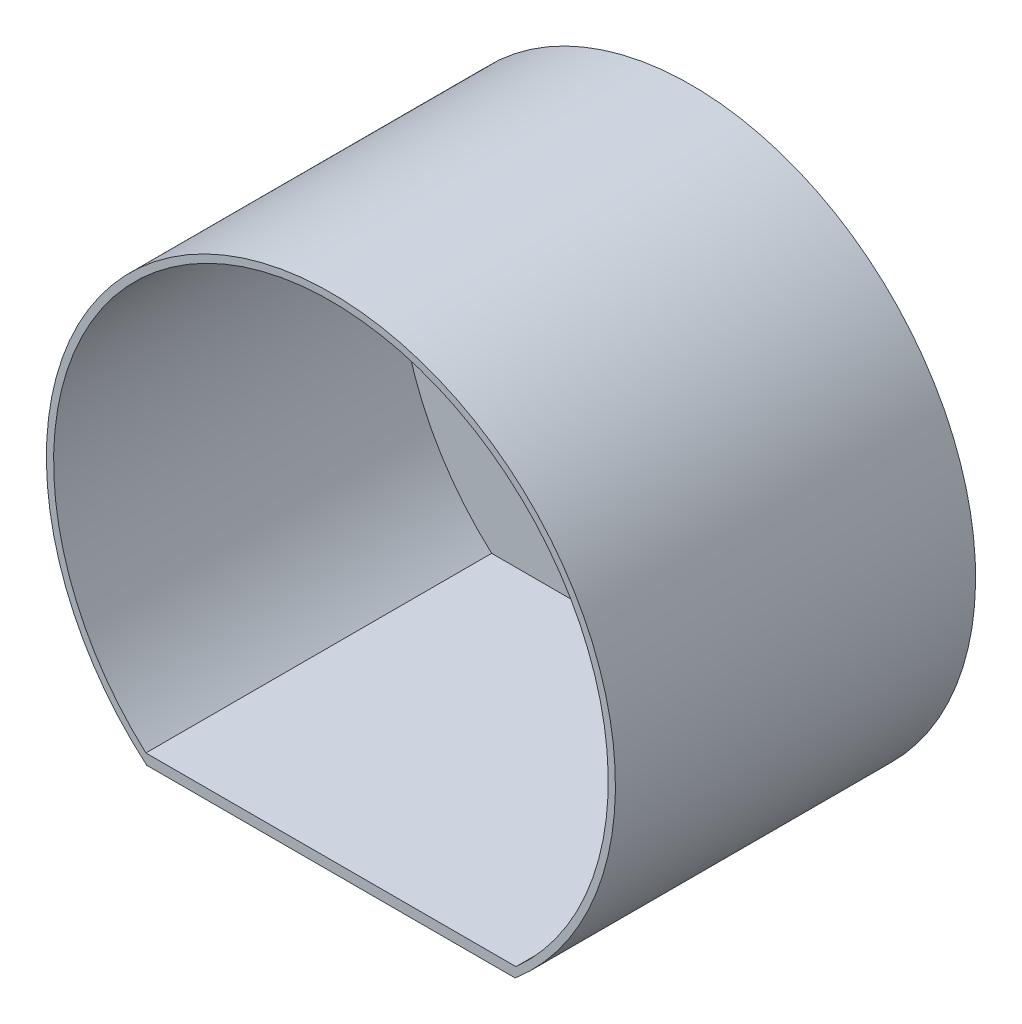
ISO-10303-21;
HEADER;
FILE_DESCRIPTION(('STEP AP214'),'2;1');
FILE_NAME('part.step','',(''),(''),'','','');
FILE_SCHEMA(('AUTOMOTIVE_DESIGN { 1 0 10303 214 1 1 1 1 }'));
ENDSEC;
DATA;
#1=APPLICATION_CONTEXT('core data for automotive mechanical design processes');
#2=APPLICATION_PROTOCOL_DEFINITION('international standard','automotive_design',2000,#1);
#3=PRODUCT_CONTEXT('',#1,'mechanical');
#4=PRODUCT('Part','Part','',(#3));
#5=PRODUCT_RELATED_PRODUCT_CATEGORY('part','',(#4));
#6=PRODUCT_DEFINITION_FORMATION('','',#4);
#7=PRODUCT_DEFINITION_CONTEXT('part definition',#1,'design');
#8=PRODUCT_DEFINITION('design','',#6,#7);
#9=PRODUCT_DEFINITION_SHAPE('','',#8);
#10=(LENGTH_UNIT() NAMED_UNIT(*) SI_UNIT(.MILLI.,.METRE.));
#11=(NAMED_UNIT(*) PLANE_ANGLE_UNIT() SI_UNIT($,.RADIAN.));
#12=(NAMED_UNIT(*) SI_UNIT($,.STERADIAN.) SOLID_ANGLE_UNIT());
#13=UNCERTAINTY_MEASURE_WITH_UNIT(LENGTH_MEASURE(1.E-05),#10,'distance_accuracy_value','');
#14=(GEOMETRIC_REPRESENTATION_CONTEXT(3) GLOBAL_UNCERTAINTY_ASSIGNED_CONTEXT((#13)) GLOBAL_UNIT_ASSIGNED_CONTEXT((#10,
#11,#12)) REPRESENTATION_CONTEXT('',''));
#15=CARTESIAN_POINT('',(0.,0.,0.));
#16=DIRECTION('',(0.,0.,1.));
#17=DIRECTION('',(1.,0.,0.));
#18=AXIS2_PLACEMENT_3D('',#15,#16,#17);
#19=CARTESIAN_POINT('',(0.,0.,0.));
#20=DIRECTION('',(0.,0.,1.));
#21=DIRECTION('',(1.,0.,0.));
#22=AXIS2_PLACEMENT_3D('',#19,#20,#21);
#23=PLANE('',#22);
#24=CARTESIAN_POINT('',(0.,0.,0.));
#25=DIRECTION('',(0.,0.,1.));
#26=DIRECTION('',(1.,0.,0.));
#27=AXIS2_PLACEMENT_3D('',#24,#25,#26);
#28=CIRCLE('',#27,39.5);
#29=CARTESIAN_POINT('',(25.5769773827383,-30.1009672263682,0.));
#30=VERTEX_POINT('',#29);
#31=CARTESIAN_POINT('',(-25.5769773827383,-30.1009672263682,0.));
#32=VERTEX_POINT('',#31);
#33=EDGE_CURVE('E99',#30,#32,#28,.T.);
#34=ORIENTED_EDGE('',*,*,#33,.F.);
#35=DIRECTION('',(1.,0.,0.));
#36=VECTOR('',#35,1.);
#37=CARTESIAN_POINT('',(-25.5769773827383,-30.1009672263682,0.));
#38=LINE('',#37,#36);
#39=EDGE_CURVE('E108',#32,#30,#38,.T.);
#40=ORIENTED_EDGE('',*,*,#39,.F.);
#41=EDGE_LOOP('',(#34,#40));
#42=FACE_BOUND('',#41,.T.);
#43=CARTESIAN_POINT('',(0.,18.,0.));
#44=DIRECTION('',(0.,0.,-1.));
#45=DIRECTION('',(-1.,0.,0.));
#46=AXIS2_PLACEMENT_3D('',#43,#44,#45);
#47=CIRCLE('',#46,6.);
#48=CARTESIAN_POINT('',(-6.,18.,0.));
#49=VERTEX_POINT('',#48);
#50=EDGE_CURVE('E130',#49,#49,#47,.T.);
#51=ORIENTED_EDGE('',*,*,#50,.F.);
#52=EDGE_LOOP('',(#51));
#53=FACE_BOUND('',#52,.T.);
#54=CARTESIAN_POINT('',(0.,0.,0.));
#55=DIRECTION('',(0.,0.,1.));
#56=DIRECTION('',(1.,0.,0.));
#57=AXIS2_PLACEMENT_3D('',#54,#55,#56);
#58=CIRCLE('',#57,9.);
#59=CARTESIAN_POINT('',(9.,0.,0.));
#60=VERTEX_POINT('',#59);
#61=EDGE_CURVE('E13',#60,#60,#58,.F.);
#62=ORIENTED_EDGE('',*,*,#61,.F.);
#63=EDGE_LOOP('',(#62));
#64=FACE_BOUND('',#63,.T.);
#65=ADVANCED_FACE('F45',(#42,#53,#64),#23,.F.);
#66=CARTESIAN_POINT('',(0.,0.,50.));
#67=DIRECTION('',(0.,0.,-1.));
#68=DIRECTION('',(-1.,0.,0.));
#69=AXIS2_PLACEMENT_3D('',#66,#67,#68);
#70=CYLINDRICAL_SURFACE('',#69,38.5);
#71=DIRECTION('',(0.,0.,-1.));
#72=VECTOR('',#71,1.);
#73=CARTESIAN_POINT('',(-25.6870787784794,-28.6779354875519,50.));
#74=LINE('',#73,#72);
#75=CARTESIAN_POINT('',(-25.6870787784794,-28.6779354875519,50.));
#76=VERTEX_POINT('',#75);
#77=CARTESIAN_POINT('',(-25.6870787784794,-28.6779354875519,2.));
#78=VERTEX_POINT('',#77);
#79=EDGE_CURVE('E66',#76,#78,#74,.T.);
#80=ORIENTED_EDGE('',*,*,#79,.T.);
#81=CARTESIAN_POINT('',(0.,0.,2.));
#82=DIRECTION('',(0.,0.,-1.));
#83=DIRECTION('',(-1.,0.,0.));
#84=AXIS2_PLACEMENT_3D('',#81,#82,#83);
#85=CIRCLE('',#84,38.5);
#86=CARTESIAN_POINT('',(25.6870787784794,-28.6779354875519,2.));
#87=VERTEX_POINT('',#86);
#88=EDGE_CURVE('E59',#78,#87,#85,.T.);
#89=ORIENTED_EDGE('',*,*,#88,.T.);
#90=DIRECTION('',(0.,0.,-1.));
#91=VECTOR('',#90,1.);
#92=CARTESIAN_POINT('',(25.6870787784794,-28.6779354875519,50.));
#93=LINE('',#92,#91);
#94=CARTESIAN_POINT('',(25.6870787784794,-28.6779354875519,50.));
#95=VERTEX_POINT('',#94);
#96=EDGE_CURVE('E91',#95,#87,#93,.T.);
#97=ORIENTED_EDGE('',*,*,#96,.F.);
#98=CARTESIAN_POINT('',(0.,0.,50.));
#99=DIRECTION('',(0.,0.,1.));
#100=DIRECTION('',(1.,0.,0.));
#101=AXIS2_PLACEMENT_3D('',#98,#99,#100);
#102=CIRCLE('',#101,38.5);
#103=EDGE_CURVE('E86',#95,#76,#102,.T.);
#104=ORIENTED_EDGE('',*,*,#103,.T.);
#105=EDGE_LOOP('',(#80,#89,#97,#104));
#106=FACE_BOUND('',#105,.T.);
#107=ADVANCED_FACE('F90',(#106),#70,.F.);
#108=CARTESIAN_POINT('',(-25.6870787784794,-28.6779354875519,50.));
#109=DIRECTION('',(0.,1.,0.));
#110=DIRECTION('',(0.,0.,1.));
#111=AXIS2_PLACEMENT_3D('',#108,#109,#110);
#112=PLANE('',#111);
#113=ORIENTED_EDGE('',*,*,#96,.T.);
#114=DIRECTION('',(-1.,0.,0.));
#115=VECTOR('',#114,1.);
#116=CARTESIAN_POINT('',(-25.6870787784794,-28.6779354875519,2.));
#117=LINE('',#116,#115);
#118=EDGE_CURVE('E83',#87,#78,#117,.T.);
#119=ORIENTED_EDGE('',*,*,#118,.T.);
#120=ORIENTED_EDGE('',*,*,#79,.F.);
#121=DIRECTION('',(1.,0.,0.));
#122=VECTOR('',#121,1.);
#123=CARTESIAN_POINT('',(-25.6870787784794,-28.6779354875519,50.));
#124=LINE('',#123,#122);
#125=EDGE_CURVE('E97',#76,#95,#124,.T.);
#126=ORIENTED_EDGE('',*,*,#125,.T.);
#127=EDGE_LOOP('',(#113,#119,#120,#126));
#128=FACE_BOUND('',#127,.T.);
#129=ADVANCED_FACE('F95',(#128),#112,.T.);
#130=CARTESIAN_POINT('',(0.,0.,50.));
#131=DIRECTION('',(0.,0.,1.));
#132=DIRECTION('',(1.,0.,0.));
#133=AXIS2_PLACEMENT_3D('',#130,#131,#132);
#134=PLANE('',#133);
#135=CARTESIAN_POINT('',(0.,0.,50.));
#136=DIRECTION('',(0.,0.,1.));
#137=DIRECTION('',(1.,0.,0.));
#138=AXIS2_PLACEMENT_3D('',#135,#136,#137);
#139=CIRCLE('',#138,39.5);
#140=CARTESIAN_POINT('',(25.5769773827383,-30.1009672263682,50.));
#141=VERTEX_POINT('',#140);
#142=CARTESIAN_POINT('',(-25.5769773827383,-30.1009672263682,50.));
#143=VERTEX_POINT('',#142);
#144=EDGE_CURVE('E104',#141,#143,#139,.T.);
#145=ORIENTED_EDGE('',*,*,#144,.T.);
#146=DIRECTION('',(1.,0.,0.));
#147=VECTOR('',#146,1.);
#148=CARTESIAN_POINT('',(-25.5769773827383,-30.1009672263682,50.));
#149=LINE('',#148,#147);
#150=EDGE_CURVE('E107',#143,#141,#149,.T.);
#151=ORIENTED_EDGE('',*,*,#150,.T.);
#152=EDGE_LOOP('',(#145,#151));
#153=FACE_BOUND('',#152,.T.);
#154=ORIENTED_EDGE('',*,*,#125,.F.);
#155=ORIENTED_EDGE('',*,*,#103,.F.);
#156=EDGE_LOOP('',(#154,#155));
#157=FACE_BOUND('',#156,.T.);
#158=ADVANCED_FACE('F158',(#153,#157),#134,.T.);
#159=CARTESIAN_POINT('',(0.,0.,50.));
#160=DIRECTION('',(0.,0.,-1.));
#161=DIRECTION('',(-1.,0.,0.));
#162=AXIS2_PLACEMENT_3D('',#159,#160,#161);
#163=CYLINDRICAL_SURFACE('',#162,39.5);
#164=ORIENTED_EDGE('',*,*,#33,.T.);
#165=DIRECTION('',(0.,0.,-1.));
#166=VECTOR('',#165,1.);
#167=CARTESIAN_POINT('',(-25.5769773827383,-30.1009672263682,50.));
#168=LINE('',#167,#166);
#169=EDGE_CURVE('E53',#143,#32,#168,.T.);
#170=ORIENTED_EDGE('',*,*,#169,.F.);
#171=ORIENTED_EDGE('',*,*,#144,.F.);
#172=DIRECTION('',(0.,0.,-1.));
#173=VECTOR('',#172,1.);
#174=CARTESIAN_POINT('',(25.5769773827383,-30.1009672263682,50.));
#175=LINE('',#174,#173);
#176=EDGE_CURVE('E110',#141,#30,#175,.T.);
#177=ORIENTED_EDGE('',*,*,#176,.T.);
#178=EDGE_LOOP('',(#164,#170,#171,#177));
#179=FACE_BOUND('',#178,.T.);
#180=ADVANCED_FACE('F47',(#179),#163,.T.);
#181=CARTESIAN_POINT('',(-25.5769773827383,-30.1009672263682,50.));
#182=DIRECTION('',(0.,1.,0.));
#183=DIRECTION('',(0.,0.,1.));
#184=AXIS2_PLACEMENT_3D('',#181,#182,#183);
#185=PLANE('',#184);
#186=ORIENTED_EDGE('',*,*,#39,.T.);
#187=ORIENTED_EDGE('',*,*,#176,.F.);
#188=ORIENTED_EDGE('',*,*,#150,.F.);
#189=ORIENTED_EDGE('',*,*,#169,.T.);
#190=EDGE_LOOP('',(#186,#187,#188,#189));
#191=FACE_BOUND('',#190,.T.);
#192=ADVANCED_FACE('F118',(#191),#185,.F.);
#193=CARTESIAN_POINT('',(0.,0.,2.));
#194=DIRECTION('',(0.,0.,-1.));
#195=DIRECTION('',(-1.,0.,0.));
#196=AXIS2_PLACEMENT_3D('',#193,#194,#195);
#197=PLANE('',#196);
#198=CARTESIAN_POINT('',(0.,18.,2.));
#199=DIRECTION('',(0.,0.,-1.));
#200=DIRECTION('',(-1.,0.,0.));
#201=AXIS2_PLACEMENT_3D('',#198,#199,#200);
#202=CIRCLE('',#201,6.);
#203=CARTESIAN_POINT('',(-6.,18.,2.));
#204=VERTEX_POINT('',#203);
#205=EDGE_CURVE('E239',#204,#204,#202,.F.);
#206=ORIENTED_EDGE('',*,*,#205,.F.);
#207=EDGE_LOOP('',(#206));
#208=FACE_BOUND('',#207,.T.);
#209=CARTESIAN_POINT('',(0.,0.,2.));
#210=DIRECTION('',(0.,0.,-1.));
#211=DIRECTION('',(-1.,0.,0.));
#212=AXIS2_PLACEMENT_3D('',#209,#210,#211);
#213=CIRCLE('',#212,6.);
#214=CARTESIAN_POINT('',(-6.,0.,2.));
#215=VERTEX_POINT('',#214);
#216=EDGE_CURVE('E93',#215,#215,#213,.F.);
#217=ORIENTED_EDGE('',*,*,#216,.F.);
#218=EDGE_LOOP('',(#217));
#219=FACE_BOUND('',#218,.T.);
#220=ORIENTED_EDGE('',*,*,#88,.F.);
#221=ORIENTED_EDGE('',*,*,#118,.F.);
#222=EDGE_LOOP('',(#220,#221));
#223=FACE_BOUND('',#222,.T.);
#224=ADVANCED_FACE('F84',(#208,#219,#223),#197,.F.);
#225=CARTESIAN_POINT('',(0.,0.,18.9705627484771));
#226=DIRECTION('',(0.,0.,-1.));
#227=DIRECTION('',(-1.,0.,0.));
#228=AXIS2_PLACEMENT_3D('',#225,#226,#227);
#229=CYLINDRICAL_SURFACE('',#228,6.);
#230=ORIENTED_EDGE('',*,*,#216,.T.);
#231=EDGE_LOOP('',(#230));
#232=FACE_BOUND('',#231,.T.);
#233=CARTESIAN_POINT('',(0.,0.,-20.));
#234=DIRECTION('',(0.,0.,-1.));
#235=DIRECTION('',(-1.,0.,0.));
#236=AXIS2_PLACEMENT_3D('',#233,#234,#235);
#237=CIRCLE('',#236,6.);
#238=CARTESIAN_POINT('',(-6.,0.,-20.));
#239=VERTEX_POINT('',#238);
#240=EDGE_CURVE('E246',#239,#239,#237,.T.);
#241=ORIENTED_EDGE('',*,*,#240,.T.);
#242=EDGE_LOOP('',(#241));
#243=FACE_BOUND('',#242,.T.);
#244=ADVANCED_FACE('F148',(#232,#243),#229,.F.);
#245=CARTESIAN_POINT('',(0.,18.,18.9705627484771));
#246=DIRECTION('',(0.,0.,-1.));
#247=DIRECTION('',(-1.,0.,0.));
#248=AXIS2_PLACEMENT_3D('',#245,#246,#247);
#249=CYLINDRICAL_SURFACE('',#248,6.);
#250=ORIENTED_EDGE('',*,*,#205,.T.);
#251=EDGE_LOOP('',(#250));
#252=FACE_BOUND('',#251,.T.);
#253=ORIENTED_EDGE('',*,*,#50,.T.);
#254=EDGE_LOOP('',(#253));
#255=FACE_BOUND('',#254,.T.);
#256=ADVANCED_FACE('F141',(#252,#255),#249,.F.);
#257=CARTESIAN_POINT('',(0.,0.,-20.));
#258=DIRECTION('',(0.,0.,-1.));
#259=DIRECTION('',(-1.,0.,0.));
#260=AXIS2_PLACEMENT_3D('',#257,#258,#259);
#261=PLANE('',#260);
#262=CARTESIAN_POINT('',(0.,0.,-20.));
#263=DIRECTION('',(0.,0.,-1.));
#264=DIRECTION('',(-1.,0.,0.));
#265=AXIS2_PLACEMENT_3D('',#262,#263,#264);
#266=CIRCLE('',#265,9.);
#267=CARTESIAN_POINT('',(-9.,0.,-20.));
#268=VERTEX_POINT('',#267);
#269=EDGE_CURVE('E243',#268,#268,#266,.T.);
#270=ORIENTED_EDGE('',*,*,#269,.T.);
#271=EDGE_LOOP('',(#270));
#272=FACE_BOUND('',#271,.T.);
#273=ORIENTED_EDGE('',*,*,#240,.F.);
#274=EDGE_LOOP('',(#273));
#275=FACE_BOUND('',#274,.T.);
#276=ADVANCED_FACE('F135',(#272,#275),#261,.T.);
#277=CARTESIAN_POINT('',(0.,0.,-20.));
#278=DIRECTION('',(0.,0.,1.));
#279=DIRECTION('',(1.,0.,0.));
#280=AXIS2_PLACEMENT_3D('',#277,#278,#279);
#281=CYLINDRICAL_SURFACE('',#280,9.);
#282=ORIENTED_EDGE('',*,*,#269,.F.);
#283=EDGE_LOOP('',(#282));
#284=FACE_BOUND('',#283,.T.);
#285=ORIENTED_EDGE('',*,*,#61,.T.);
#286=EDGE_LOOP('',(#285));
#287=FACE_BOUND('',#286,.T.);
#288=ADVANCED_FACE('F133',(#284,#287),#281,.T.);
#289=CLOSED_SHELL('',(#65,#107,#129,#158,#180,#192,#224,#244,#256,#276,#288));
#290=MANIFOLD_SOLID_BREP('B2',#289);
#291=ADVANCED_BREP_SHAPE_REPRESENTATION('',(#18,#290),#14);
#292=SHAPE_DEFINITION_REPRESENTATION(#9,#291);
ENDSEC;
END-ISO-10303-21;
